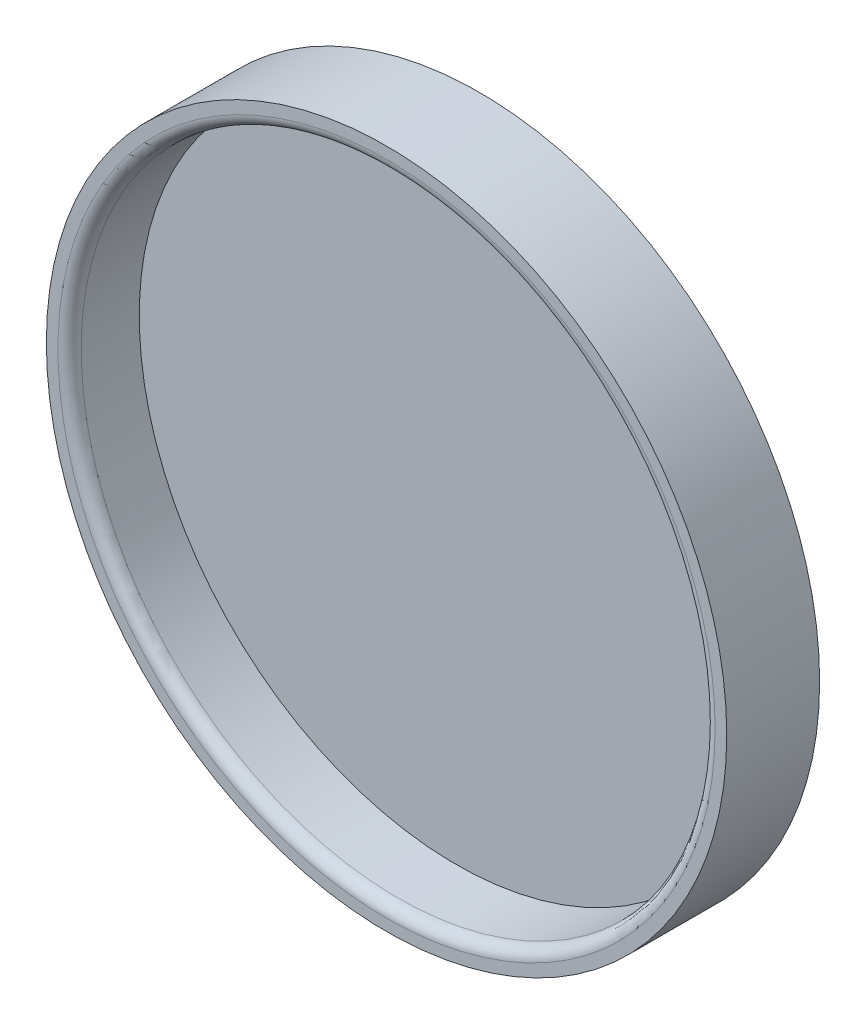
ISO-10303-21;
HEADER;
FILE_DESCRIPTION(('STEP AP214'),'2;1');
FILE_NAME('part.step','',(''),(''),'','','');
FILE_SCHEMA(('AUTOMOTIVE_DESIGN { 1 0 10303 214 1 1 1 1 }'));
ENDSEC;
DATA;
#1=APPLICATION_CONTEXT('core data for automotive mechanical design processes');
#2=APPLICATION_PROTOCOL_DEFINITION('international standard','automotive_design',2000,#1);
#3=PRODUCT_CONTEXT('',#1,'mechanical');
#4=PRODUCT('Part','Part','',(#3));
#5=PRODUCT_RELATED_PRODUCT_CATEGORY('part','',(#4));
#6=PRODUCT_DEFINITION_FORMATION('','',#4);
#7=PRODUCT_DEFINITION_CONTEXT('part definition',#1,'design');
#8=PRODUCT_DEFINITION('design','',#6,#7);
#9=PRODUCT_DEFINITION_SHAPE('','',#8);
#10=(LENGTH_UNIT() NAMED_UNIT(*) SI_UNIT(.MILLI.,.METRE.));
#11=(NAMED_UNIT(*) PLANE_ANGLE_UNIT() SI_UNIT($,.RADIAN.));
#12=(NAMED_UNIT(*) SI_UNIT($,.STERADIAN.) SOLID_ANGLE_UNIT());
#13=UNCERTAINTY_MEASURE_WITH_UNIT(LENGTH_MEASURE(1.E-05),#10,'distance_accuracy_value','');
#14=(GEOMETRIC_REPRESENTATION_CONTEXT(3) GLOBAL_UNCERTAINTY_ASSIGNED_CONTEXT((#13)) GLOBAL_UNIT_ASSIGNED_CONTEXT((#10,
#11,#12)) REPRESENTATION_CONTEXT('',''));
#15=CARTESIAN_POINT('',(0.,0.,0.));
#16=DIRECTION('',(0.,0.,1.));
#17=DIRECTION('',(1.,0.,0.));
#18=AXIS2_PLACEMENT_3D('',#15,#16,#17);
#19=CARTESIAN_POINT('',(0.,0.,1.));
#20=DIRECTION('',(0.,0.,-1.));
#21=DIRECTION('',(-1.,0.,0.));
#22=AXIS2_PLACEMENT_3D('',#19,#20,#21);
#23=CYLINDRICAL_SURFACE('',#22,14.65);
#24=CARTESIAN_POINT('',(0.,0.,0.));
#25=DIRECTION('',(0.,0.,1.));
#26=DIRECTION('',(1.,0.,0.));
#27=AXIS2_PLACEMENT_3D('',#24,#25,#26);
#28=CIRCLE('',#27,14.65);
#29=CARTESIAN_POINT('',(14.65,0.,0.));
#30=VERTEX_POINT('',#29);
#31=EDGE_CURVE('E56',#30,#30,#28,.T.);
#32=ORIENTED_EDGE('',*,*,#31,.T.);
#33=EDGE_LOOP('',(#32));
#34=FACE_BOUND('',#33,.T.);
#35=CARTESIAN_POINT('',(0.,0.,4.));
#36=DIRECTION('',(0.,0.,1.));
#37=DIRECTION('',(1.,0.,0.));
#38=AXIS2_PLACEMENT_3D('',#35,#36,#37);
#39=CIRCLE('',#38,14.65);
#40=CARTESIAN_POINT('',(14.65,0.,4.));
#41=VERTEX_POINT('',#40);
#42=EDGE_CURVE('E61',#41,#41,#39,.T.);
#43=ORIENTED_EDGE('',*,*,#42,.F.);
#44=EDGE_LOOP('',(#43));
#45=FACE_BOUND('',#44,.T.);
#46=ADVANCED_FACE('F41',(#34,#45),#23,.T.);
#47=CARTESIAN_POINT('',(0.,0.,0.));
#48=DIRECTION('',(0.,0.,1.));
#49=DIRECTION('',(1.,0.,0.));
#50=AXIS2_PLACEMENT_3D('',#47,#48,#49);
#51=PLANE('',#50);
#52=ORIENTED_EDGE('',*,*,#31,.F.);
#53=EDGE_LOOP('',(#52));
#54=FACE_BOUND('',#53,.T.);
#55=ADVANCED_FACE('F68',(#54),#51,.F.);
#56=CARTESIAN_POINT('',(0.,0.,4.));
#57=DIRECTION('',(0.,0.,1.));
#58=DIRECTION('',(1.,0.,0.));
#59=AXIS2_PLACEMENT_3D('',#56,#57,#58);
#60=PLANE('',#59);
#61=CARTESIAN_POINT('',(0.,0.,4.));
#62=DIRECTION('',(0.,0.,1.));
#63=DIRECTION('',(1.,0.,0.));
#64=AXIS2_PLACEMENT_3D('',#61,#62,#63);
#65=CIRCLE('',#64,14.15);
#66=CARTESIAN_POINT('',(14.15,0.,4.));
#67=VERTEX_POINT('',#66);
#68=EDGE_CURVE('E10',#67,#67,#65,.F.);
#69=ORIENTED_EDGE('',*,*,#68,.T.);
#70=EDGE_LOOP('',(#69));
#71=FACE_BOUND('',#70,.T.);
#72=ORIENTED_EDGE('',*,*,#42,.T.);
#73=EDGE_LOOP('',(#72));
#74=FACE_BOUND('',#73,.T.);
#75=ADVANCED_FACE('F65',(#71,#74),#60,.T.);
#76=CARTESIAN_POINT('',(0.,0.,4.));
#77=DIRECTION('',(0.,0.,-1.));
#78=DIRECTION('',(-1.,0.,0.));
#79=AXIS2_PLACEMENT_3D('',#76,#77,#78);
#80=CYLINDRICAL_SURFACE('',#79,13.65);
#81=CARTESIAN_POINT('',(0.,0.,3.5));
#82=DIRECTION('',(0.,0.,1.));
#83=DIRECTION('',(1.,0.,0.));
#84=AXIS2_PLACEMENT_3D('',#81,#82,#83);
#85=CIRCLE('',#84,13.65);
#86=CARTESIAN_POINT('',(13.65,0.,3.5));
#87=VERTEX_POINT('',#86);
#88=EDGE_CURVE('E48',#87,#87,#85,.T.);
#89=ORIENTED_EDGE('',*,*,#88,.T.);
#90=EDGE_LOOP('',(#89));
#91=FACE_BOUND('',#90,.T.);
#92=CARTESIAN_POINT('',(0.,0.,1.));
#93=DIRECTION('',(0.,0.,1.));
#94=DIRECTION('',(1.,0.,0.));
#95=AXIS2_PLACEMENT_3D('',#92,#93,#94);
#96=CIRCLE('',#95,13.65);
#97=CARTESIAN_POINT('',(13.65,0.,1.));
#98=VERTEX_POINT('',#97);
#99=EDGE_CURVE('E52',#98,#98,#96,.F.);
#100=ORIENTED_EDGE('',*,*,#99,.T.);
#101=EDGE_LOOP('',(#100));
#102=FACE_BOUND('',#101,.T.);
#103=ADVANCED_FACE('F79',(#91,#102),#80,.F.);
#104=CARTESIAN_POINT('',(0.,0.,1.));
#105=DIRECTION('',(0.,0.,1.));
#106=DIRECTION('',(1.,0.,0.));
#107=AXIS2_PLACEMENT_3D('',#104,#105,#106);
#108=PLANE('',#107);
#109=ORIENTED_EDGE('',*,*,#99,.F.);
#110=EDGE_LOOP('',(#109));
#111=FACE_BOUND('',#110,.T.);
#112=ADVANCED_FACE('F77',(#111),#108,.T.);
#113=CARTESIAN_POINT('',(0.,0.,3.5));
#114=DIRECTION('',(0.,0.,1.));
#115=DIRECTION('',(1.,0.,0.));
#116=AXIS2_PLACEMENT_3D('',#113,#114,#115);
#117=TOROIDAL_SURFACE('',#116,14.15,0.5);
#118=ORIENTED_EDGE('',*,*,#68,.F.);
#119=EDGE_LOOP('',(#118));
#120=FACE_BOUND('',#119,.T.);
#121=ORIENTED_EDGE('',*,*,#88,.F.);
#122=EDGE_LOOP('',(#121));
#123=FACE_BOUND('',#122,.T.);
#124=ADVANCED_FACE('F43',(#120,#123),#117,.T.);
#125=CLOSED_SHELL('',(#46,#55,#75,#103,#112,#124));
#126=MANIFOLD_SOLID_BREP('B2',#125);
#127=ADVANCED_BREP_SHAPE_REPRESENTATION('',(#18,#126),#14);
#128=SHAPE_DEFINITION_REPRESENTATION(#9,#127);
ENDSEC;
END-ISO-10303-21;
